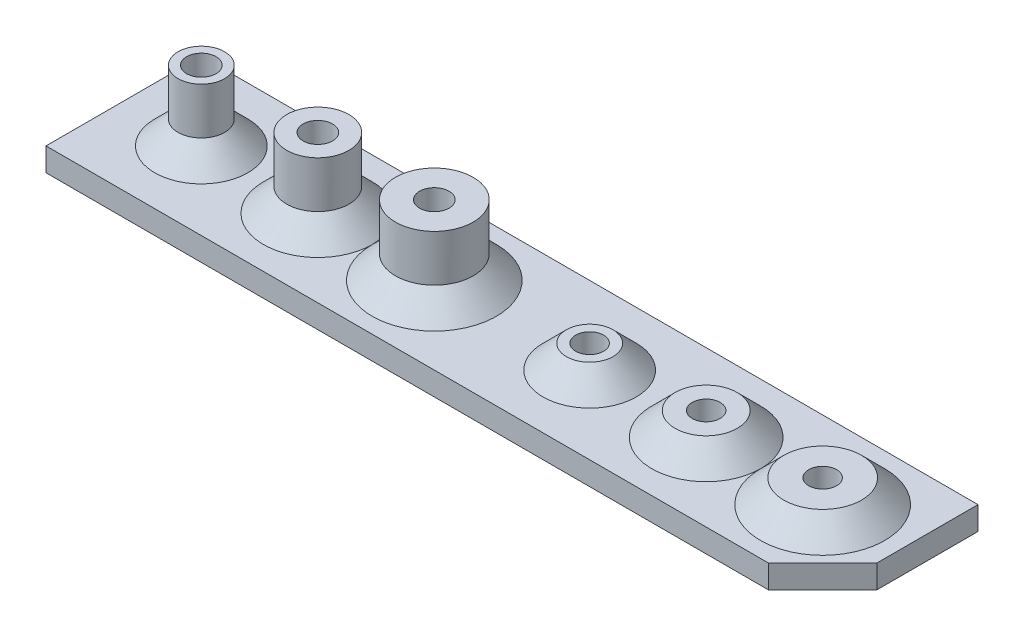
ISO-10303-21;
HEADER;
FILE_DESCRIPTION(('STEP AP214'),'2;1');
FILE_NAME('part.step','',(''),(''),'','','');
FILE_SCHEMA(('AUTOMOTIVE_DESIGN { 1 0 10303 214 1 1 1 1 }'));
ENDSEC;
DATA;
#1=APPLICATION_CONTEXT('core data for automotive mechanical design processes');
#2=APPLICATION_PROTOCOL_DEFINITION('international standard','automotive_design',2000,#1);
#3=PRODUCT_CONTEXT('',#1,'mechanical');
#4=PRODUCT('Part','Part','',(#3));
#5=PRODUCT_RELATED_PRODUCT_CATEGORY('part','',(#4));
#6=PRODUCT_DEFINITION_FORMATION('','',#4);
#7=PRODUCT_DEFINITION_CONTEXT('part definition',#1,'design');
#8=PRODUCT_DEFINITION('design','',#6,#7);
#9=PRODUCT_DEFINITION_SHAPE('','',#8);
#10=(LENGTH_UNIT() NAMED_UNIT(*) SI_UNIT(.MILLI.,.METRE.));
#11=(NAMED_UNIT(*) PLANE_ANGLE_UNIT() SI_UNIT($,.RADIAN.));
#12=(NAMED_UNIT(*) SI_UNIT($,.STERADIAN.) SOLID_ANGLE_UNIT());
#13=UNCERTAINTY_MEASURE_WITH_UNIT(LENGTH_MEASURE(1.E-05),#10,'distance_accuracy_value','');
#14=(GEOMETRIC_REPRESENTATION_CONTEXT(3) GLOBAL_UNCERTAINTY_ASSIGNED_CONTEXT((#13)) GLOBAL_UNIT_ASSIGNED_CONTEXT((#10,
#11,#12)) REPRESENTATION_CONTEXT('',''));
#15=CARTESIAN_POINT('',(0.,0.,0.));
#16=DIRECTION('',(0.,0.,1.));
#17=DIRECTION('',(1.,0.,0.));
#18=AXIS2_PLACEMENT_3D('',#15,#16,#17);
#19=CARTESIAN_POINT('',(50.,3.,10.));
#20=DIRECTION('',(-1.,0.,0.));
#21=DIRECTION('',(0.,0.,1.));
#22=AXIS2_PLACEMENT_3D('',#19,#20,#21);
#23=PLANE('',#22);
#24=DIRECTION('',(0.,0.,-1.));
#25=VECTOR('',#24,1.);
#26=CARTESIAN_POINT('',(50.,3.,10.));
#27=LINE('',#26,#25);
#28=CARTESIAN_POINT('',(50.,3.,3.00000000000001));
#29=VERTEX_POINT('',#28);
#30=CARTESIAN_POINT('',(50.,3.,-10.));
#31=VERTEX_POINT('',#30);
#32=EDGE_CURVE('E93',#29,#31,#27,.T.);
#33=ORIENTED_EDGE('',*,*,#32,.F.);
#34=DIRECTION('',(0.,-1.,0.));
#35=VECTOR('',#34,1.);
#36=CARTESIAN_POINT('',(50.,3.,3.00000000000001));
#37=LINE('',#36,#35);
#38=CARTESIAN_POINT('',(50.,0.,3.00000000000001));
#39=VERTEX_POINT('',#38);
#40=EDGE_CURVE('E152',#29,#39,#37,.T.);
#41=ORIENTED_EDGE('',*,*,#40,.T.);
#42=DIRECTION('',(0.,0.,-1.));
#43=VECTOR('',#42,1.);
#44=CARTESIAN_POINT('',(50.,0.,10.));
#45=LINE('',#44,#43);
#46=CARTESIAN_POINT('',(50.,0.,-10.));
#47=VERTEX_POINT('',#46);
#48=EDGE_CURVE('E114',#39,#47,#45,.T.);
#49=ORIENTED_EDGE('',*,*,#48,.T.);
#50=DIRECTION('',(0.,-1.,0.));
#51=VECTOR('',#50,1.);
#52=CARTESIAN_POINT('',(50.,3.,-10.));
#53=LINE('',#52,#51);
#54=EDGE_CURVE('E108',#31,#47,#53,.T.);
#55=ORIENTED_EDGE('',*,*,#54,.F.);
#56=EDGE_LOOP('',(#33,#41,#49,#55));
#57=FACE_BOUND('',#56,.T.);
#58=ADVANCED_FACE('F35',(#57),#23,.F.);
#59=CARTESIAN_POINT('',(-50.,3.,-10.));
#60=DIRECTION('',(0.,0.,1.));
#61=DIRECTION('',(1.,0.,0.));
#62=AXIS2_PLACEMENT_3D('',#59,#60,#61);
#63=PLANE('',#62);
#64=DIRECTION('',(-1.,0.,0.));
#65=VECTOR('',#64,1.);
#66=CARTESIAN_POINT('',(-50.,0.,-10.));
#67=LINE('',#66,#65);
#68=CARTESIAN_POINT('',(-50.,0.,-10.));
#69=VERTEX_POINT('',#68);
#70=EDGE_CURVE('E172',#47,#69,#67,.T.);
#71=ORIENTED_EDGE('',*,*,#70,.T.);
#72=DIRECTION('',(0.,-1.,0.));
#73=VECTOR('',#72,1.);
#74=CARTESIAN_POINT('',(-50.,3.,-10.));
#75=LINE('',#74,#73);
#76=CARTESIAN_POINT('',(-50.,3.,-10.));
#77=VERTEX_POINT('',#76);
#78=EDGE_CURVE('E110',#77,#69,#75,.T.);
#79=ORIENTED_EDGE('',*,*,#78,.F.);
#80=DIRECTION('',(-1.,0.,0.));
#81=VECTOR('',#80,1.);
#82=CARTESIAN_POINT('',(-50.,3.,-10.));
#83=LINE('',#82,#81);
#84=EDGE_CURVE('E96',#31,#77,#83,.T.);
#85=ORIENTED_EDGE('',*,*,#84,.F.);
#86=ORIENTED_EDGE('',*,*,#54,.T.);
#87=EDGE_LOOP('',(#71,#79,#85,#86));
#88=FACE_BOUND('',#87,.T.);
#89=ADVANCED_FACE('F107',(#88),#63,.F.);
#90=CARTESIAN_POINT('',(-50.,3.,10.));
#91=DIRECTION('',(1.,0.,0.));
#92=DIRECTION('',(0.,0.,-1.));
#93=AXIS2_PLACEMENT_3D('',#90,#91,#92);
#94=PLANE('',#93);
#95=DIRECTION('',(0.,0.,1.));
#96=VECTOR('',#95,1.);
#97=CARTESIAN_POINT('',(-50.,0.,10.));
#98=LINE('',#97,#96);
#99=CARTESIAN_POINT('',(-50.,0.,10.));
#100=VERTEX_POINT('',#99);
#101=EDGE_CURVE('E175',#69,#100,#98,.T.);
#102=ORIENTED_EDGE('',*,*,#101,.T.);
#103=DIRECTION('',(0.,-1.,0.));
#104=VECTOR('',#103,1.);
#105=CARTESIAN_POINT('',(-50.,3.,10.));
#106=LINE('',#105,#104);
#107=CARTESIAN_POINT('',(-50.,3.,10.));
#108=VERTEX_POINT('',#107);
#109=EDGE_CURVE('E121',#108,#100,#106,.T.);
#110=ORIENTED_EDGE('',*,*,#109,.F.);
#111=DIRECTION('',(0.,0.,1.));
#112=VECTOR('',#111,1.);
#113=CARTESIAN_POINT('',(-50.,3.,10.));
#114=LINE('',#113,#112);
#115=EDGE_CURVE('E112',#77,#108,#114,.T.);
#116=ORIENTED_EDGE('',*,*,#115,.F.);
#117=ORIENTED_EDGE('',*,*,#78,.T.);
#118=EDGE_LOOP('',(#102,#110,#116,#117));
#119=FACE_BOUND('',#118,.T.);
#120=ADVANCED_FACE('F298',(#119),#94,.F.);
#121=CARTESIAN_POINT('',(-50.,3.,10.));
#122=DIRECTION('',(0.,0.,-1.));
#123=DIRECTION('',(-1.,0.,0.));
#124=AXIS2_PLACEMENT_3D('',#121,#122,#123);
#125=PLANE('',#124);
#126=DIRECTION('',(1.,0.,0.));
#127=VECTOR('',#126,1.);
#128=CARTESIAN_POINT('',(-50.,0.,10.));
#129=LINE('',#128,#127);
#130=CARTESIAN_POINT('',(43.,0.,10.));
#131=VERTEX_POINT('',#130);
#132=EDGE_CURVE('E103',#100,#131,#129,.T.);
#133=ORIENTED_EDGE('',*,*,#132,.T.);
#134=DIRECTION('',(0.,1.,0.));
#135=VECTOR('',#134,1.);
#136=CARTESIAN_POINT('',(43.,3.,10.));
#137=LINE('',#136,#135);
#138=CARTESIAN_POINT('',(43.,3.,10.));
#139=VERTEX_POINT('',#138);
#140=EDGE_CURVE('E43',#131,#139,#137,.T.);
#141=ORIENTED_EDGE('',*,*,#140,.T.);
#142=DIRECTION('',(1.,0.,0.));
#143=VECTOR('',#142,1.);
#144=CARTESIAN_POINT('',(-50.,3.,10.));
#145=LINE('',#144,#143);
#146=EDGE_CURVE('E181',#108,#139,#145,.T.);
#147=ORIENTED_EDGE('',*,*,#146,.F.);
#148=ORIENTED_EDGE('',*,*,#109,.T.);
#149=EDGE_LOOP('',(#133,#141,#147,#148));
#150=FACE_BOUND('',#149,.T.);
#151=ADVANCED_FACE('F545',(#150),#125,.F.);
#152=CARTESIAN_POINT('',(0.,3.,0.));
#153=DIRECTION('',(0.,-1.,0.));
#154=DIRECTION('',(0.,0.,-1.));
#155=AXIS2_PLACEMENT_3D('',#152,#153,#154);
#156=PLANE('',#155);
#157=CARTESIAN_POINT('',(40.,3.,0.));
#158=DIRECTION('',(0.,-1.,0.));
#159=DIRECTION('',(0.,0.,-1.));
#160=AXIS2_PLACEMENT_3D('',#157,#158,#159);
#161=CIRCLE('',#160,7.99999999999999);
#162=CARTESIAN_POINT('',(32.,3.,0.));
#163=VERTEX_POINT('',#162);
#164=CARTESIAN_POINT('',(40.,3.,-7.99999999999999));
#165=VERTEX_POINT('',#164);
#166=EDGE_CURVE('E147',#163,#165,#161,.T.);
#167=ORIENTED_EDGE('',*,*,#166,.T.);
#168=CARTESIAN_POINT('',(40.,3.,0.));
#169=DIRECTION('',(0.,-1.,0.));
#170=DIRECTION('',(0.,0.,-1.));
#171=AXIS2_PLACEMENT_3D('',#168,#169,#170);
#172=CIRCLE('',#171,7.99999999999999);
#173=EDGE_CURVE('E149',#165,#163,#172,.T.);
#174=ORIENTED_EDGE('',*,*,#173,.T.);
#175=CARTESIAN_POINT('',(25.,3.,0.));
#176=DIRECTION('',(0.,-1.,0.));
#177=DIRECTION('',(0.,0.,-1.));
#178=AXIS2_PLACEMENT_3D('',#175,#176,#177);
#179=CIRCLE('',#178,6.99999999999999);
#180=CARTESIAN_POINT('',(25.,3.,-6.99999999999999));
#181=VERTEX_POINT('',#180);
#182=EDGE_CURVE('E142',#163,#181,#179,.T.);
#183=ORIENTED_EDGE('',*,*,#182,.T.);
#184=CARTESIAN_POINT('',(25.,3.,0.));
#185=DIRECTION('',(0.,-1.,0.));
#186=DIRECTION('',(0.,0.,-1.));
#187=AXIS2_PLACEMENT_3D('',#184,#185,#186);
#188=CIRCLE('',#187,6.99999999999999);
#189=EDGE_CURVE('E144',#181,#163,#188,.T.);
#190=ORIENTED_EDGE('',*,*,#189,.T.);
#191=EDGE_LOOP('',(#167,#174,#183,#190));
#192=FACE_BOUND('',#191,.T.);
#193=CARTESIAN_POINT('',(9.99999999999999,3.,0.));
#194=DIRECTION('',(0.,-1.,0.));
#195=DIRECTION('',(0.,0.,-1.));
#196=AXIS2_PLACEMENT_3D('',#193,#194,#195);
#197=CIRCLE('',#196,5.99999999999999);
#198=CARTESIAN_POINT('',(9.99999999999999,3.,-5.99999999999999));
#199=VERTEX_POINT('',#198);
#200=EDGE_CURVE('E139',#199,#199,#197,.T.);
#201=ORIENTED_EDGE('',*,*,#200,.T.);
#202=EDGE_LOOP('',(#201));
#203=FACE_BOUND('',#202,.T.);
#204=CARTESIAN_POINT('',(-25.,3.,0.));
#205=DIRECTION('',(0.,-1.,0.));
#206=DIRECTION('',(0.,0.,-1.));
#207=AXIS2_PLACEMENT_3D('',#204,#205,#206);
#208=CIRCLE('',#207,6.99999999999998);
#209=CARTESIAN_POINT('',(-18.,3.,0.));
#210=VERTEX_POINT('',#209);
#211=EDGE_CURVE('E130',#210,#210,#208,.T.);
#212=ORIENTED_EDGE('',*,*,#211,.T.);
#213=CARTESIAN_POINT('',(-10.,3.,0.));
#214=DIRECTION('',(0.,-1.,0.));
#215=DIRECTION('',(0.,0.,-1.));
#216=AXIS2_PLACEMENT_3D('',#213,#214,#215);
#217=CIRCLE('',#216,7.99999999999998);
#218=EDGE_CURVE('E136',#210,#210,#217,.T.);
#219=ORIENTED_EDGE('',*,*,#218,.T.);
#220=EDGE_LOOP('',(#212,#219));
#221=FACE_BOUND('',#220,.T.);
#222=CARTESIAN_POINT('',(-40.,3.,0.));
#223=DIRECTION('',(0.,-1.,0.));
#224=DIRECTION('',(0.,0.,-1.));
#225=AXIS2_PLACEMENT_3D('',#222,#223,#224);
#226=CIRCLE('',#225,5.99999999999998);
#227=CARTESIAN_POINT('',(-40.,3.,-5.99999999999998));
#228=VERTEX_POINT('',#227);
#229=EDGE_CURVE('E119',#228,#228,#226,.T.);
#230=ORIENTED_EDGE('',*,*,#229,.T.);
#231=EDGE_LOOP('',(#230));
#232=FACE_BOUND('',#231,.T.);
#233=ORIENTED_EDGE('',*,*,#146,.T.);
#234=DIRECTION('',(-0.707106781186549,0.,0.707106781186546));
#235=VECTOR('',#234,1.);
#236=CARTESIAN_POINT('',(50.,3.,3.00000000000001));
#237=LINE('',#236,#235);
#238=EDGE_CURVE('E11',#139,#29,#237,.F.);
#239=ORIENTED_EDGE('',*,*,#238,.T.);
#240=ORIENTED_EDGE('',*,*,#32,.T.);
#241=ORIENTED_EDGE('',*,*,#84,.T.);
#242=ORIENTED_EDGE('',*,*,#115,.T.);
#243=EDGE_LOOP('',(#233,#239,#240,#241,#242));
#244=FACE_BOUND('',#243,.T.);
#245=ADVANCED_FACE('F95',(#192,#203,#221,#232,#244),#156,.F.);
#246=CARTESIAN_POINT('',(0.,0.,0.));
#247=DIRECTION('',(0.,-1.,0.));
#248=DIRECTION('',(0.,0.,-1.));
#249=AXIS2_PLACEMENT_3D('',#246,#247,#248);
#250=PLANE('',#249);
#251=CARTESIAN_POINT('',(40.,0.,0.));
#252=DIRECTION('',(0.,-1.,0.));
#253=DIRECTION('',(0.,0.,-1.));
#254=AXIS2_PLACEMENT_3D('',#251,#252,#253);
#255=CIRCLE('',#254,3.375);
#256=CARTESIAN_POINT('',(40.,0.,-3.375));
#257=VERTEX_POINT('',#256);
#258=EDGE_CURVE('E256',#257,#257,#255,.T.);
#259=ORIENTED_EDGE('',*,*,#258,.F.);
#260=EDGE_LOOP('',(#259));
#261=FACE_BOUND('',#260,.T.);
#262=CARTESIAN_POINT('',(25.,0.,0.));
#263=DIRECTION('',(0.,-1.,0.));
#264=DIRECTION('',(0.,0.,-1.));
#265=AXIS2_PLACEMENT_3D('',#262,#263,#264);
#266=CIRCLE('',#265,3.375);
#267=CARTESIAN_POINT('',(25.,0.,-3.375));
#268=VERTEX_POINT('',#267);
#269=EDGE_CURVE('E166',#268,#268,#266,.T.);
#270=ORIENTED_EDGE('',*,*,#269,.F.);
#271=EDGE_LOOP('',(#270));
#272=FACE_BOUND('',#271,.T.);
#273=CARTESIAN_POINT('',(9.99999999999999,0.,0.));
#274=DIRECTION('',(0.,-1.,0.));
#275=DIRECTION('',(0.,0.,-1.));
#276=AXIS2_PLACEMENT_3D('',#273,#274,#275);
#277=CIRCLE('',#276,3.375);
#278=CARTESIAN_POINT('',(9.99999999999999,0.,-3.375));
#279=VERTEX_POINT('',#278);
#280=EDGE_CURVE('E161',#279,#279,#277,.T.);
#281=ORIENTED_EDGE('',*,*,#280,.F.);
#282=EDGE_LOOP('',(#281));
#283=FACE_BOUND('',#282,.T.);
#284=CARTESIAN_POINT('',(-10.,0.,0.));
#285=DIRECTION('',(0.,-1.,0.));
#286=DIRECTION('',(0.,0.,-1.));
#287=AXIS2_PLACEMENT_3D('',#284,#285,#286);
#288=CIRCLE('',#287,3.5433);
#289=CARTESIAN_POINT('',(-10.,0.,-3.5433));
#290=VERTEX_POINT('',#289);
#291=EDGE_CURVE('E217',#290,#290,#288,.T.);
#292=ORIENTED_EDGE('',*,*,#291,.F.);
#293=EDGE_LOOP('',(#292));
#294=FACE_BOUND('',#293,.T.);
#295=CARTESIAN_POINT('',(-25.,0.,0.));
#296=DIRECTION('',(0.,-1.,0.));
#297=DIRECTION('',(0.,0.,-1.));
#298=AXIS2_PLACEMENT_3D('',#295,#296,#297);
#299=CIRCLE('',#298,3.5433);
#300=CARTESIAN_POINT('',(-25.,0.,-3.5433));
#301=VERTEX_POINT('',#300);
#302=EDGE_CURVE('E208',#301,#301,#299,.T.);
#303=ORIENTED_EDGE('',*,*,#302,.F.);
#304=EDGE_LOOP('',(#303));
#305=FACE_BOUND('',#304,.T.);
#306=CARTESIAN_POINT('',(-40.,0.,0.));
#307=DIRECTION('',(0.,-1.,0.));
#308=DIRECTION('',(0.,0.,-1.));
#309=AXIS2_PLACEMENT_3D('',#306,#307,#308);
#310=CIRCLE('',#309,3.5433);
#311=CARTESIAN_POINT('',(-40.,0.,-3.5433));
#312=VERTEX_POINT('',#311);
#313=EDGE_CURVE('E199',#312,#312,#310,.T.);
#314=ORIENTED_EDGE('',*,*,#313,.F.);
#315=EDGE_LOOP('',(#314));
#316=FACE_BOUND('',#315,.T.);
#317=ORIENTED_EDGE('',*,*,#48,.F.);
#318=DIRECTION('',(0.707106781186549,0.,-0.707106781186546));
#319=VECTOR('',#318,1.);
#320=CARTESIAN_POINT('',(26.4999999999999,0.,26.5));
#321=LINE('',#320,#319);
#322=EDGE_CURVE('E57',#39,#131,#321,.F.);
#323=ORIENTED_EDGE('',*,*,#322,.T.);
#324=ORIENTED_EDGE('',*,*,#132,.F.);
#325=ORIENTED_EDGE('',*,*,#101,.F.);
#326=ORIENTED_EDGE('',*,*,#70,.F.);
#327=EDGE_LOOP('',(#317,#323,#324,#325,#326));
#328=FACE_BOUND('',#327,.T.);
#329=ADVANCED_FACE('F170',(#261,#272,#283,#294,#305,#316,#328),#250,.T.);
#330=CARTESIAN_POINT('',(-40.,12.,0.));
#331=DIRECTION('',(0.,-1.,0.));
#332=DIRECTION('',(0.,0.,-1.));
#333=AXIS2_PLACEMENT_3D('',#330,#331,#332);
#334=CYLINDRICAL_SURFACE('',#333,3.);
#335=CARTESIAN_POINT('',(-40.,6.00000000000002,0.));
#336=DIRECTION('',(0.,-1.,0.));
#337=DIRECTION('',(0.,0.,-1.));
#338=AXIS2_PLACEMENT_3D('',#335,#336,#337);
#339=CIRCLE('',#338,3.);
#340=CARTESIAN_POINT('',(-40.,6.00000000000002,-3.));
#341=VERTEX_POINT('',#340);
#342=EDGE_CURVE('E116',#341,#341,#339,.F.);
#343=ORIENTED_EDGE('',*,*,#342,.T.);
#344=EDGE_LOOP('',(#343));
#345=FACE_BOUND('',#344,.T.);
#346=CARTESIAN_POINT('',(-40.,12.,0.));
#347=DIRECTION('',(0.,1.,0.));
#348=DIRECTION('',(0.,0.,1.));
#349=AXIS2_PLACEMENT_3D('',#346,#347,#348);
#350=CIRCLE('',#349,3.);
#351=CARTESIAN_POINT('',(-40.,12.,3.));
#352=VERTEX_POINT('',#351);
#353=EDGE_CURVE('E173',#352,#352,#350,.T.);
#354=ORIENTED_EDGE('',*,*,#353,.F.);
#355=EDGE_LOOP('',(#354));
#356=FACE_BOUND('',#355,.T.);
#357=ADVANCED_FACE('F264',(#345,#356),#334,.T.);
#358=CARTESIAN_POINT('',(-40.,12.,0.));
#359=DIRECTION('',(0.,1.,0.));
#360=DIRECTION('',(0.,0.,1.));
#361=AXIS2_PLACEMENT_3D('',#358,#359,#360);
#362=PLANE('',#361);
#363=CARTESIAN_POINT('',(-40.,12.,0.));
#364=DIRECTION('',(0.,-1.,0.));
#365=DIRECTION('',(0.,0.,-1.));
#366=AXIS2_PLACEMENT_3D('',#363,#364,#365);
#367=CIRCLE('',#366,1.89864999999999);
#368=CARTESIAN_POINT('',(-40.,12.,-1.89864999999999));
#369=VERTEX_POINT('',#368);
#370=EDGE_CURVE('E193',#369,#369,#367,.T.);
#371=ORIENTED_EDGE('',*,*,#370,.T.);
#372=EDGE_LOOP('',(#371));
#373=FACE_BOUND('',#372,.T.);
#374=ORIENTED_EDGE('',*,*,#353,.T.);
#375=EDGE_LOOP('',(#374));
#376=FACE_BOUND('',#375,.T.);
#377=ADVANCED_FACE('F580',(#373,#376),#362,.T.);
#378=CARTESIAN_POINT('',(-25.,12.,0.));
#379=DIRECTION('',(0.,-1.,0.));
#380=DIRECTION('',(0.,0.,-1.));
#381=AXIS2_PLACEMENT_3D('',#378,#379,#380);
#382=CYLINDRICAL_SURFACE('',#381,4.);
#383=CARTESIAN_POINT('',(-25.,6.00000000000002,0.));
#384=DIRECTION('',(0.,-1.,0.));
#385=DIRECTION('',(0.,0.,-1.));
#386=AXIS2_PLACEMENT_3D('',#383,#384,#385);
#387=CIRCLE('',#386,4.);
#388=CARTESIAN_POINT('',(-25.,6.00000000000002,-4.));
#389=VERTEX_POINT('',#388);
#390=EDGE_CURVE('E127',#389,#389,#387,.F.);
#391=ORIENTED_EDGE('',*,*,#390,.T.);
#392=EDGE_LOOP('',(#391));
#393=FACE_BOUND('',#392,.T.);
#394=CARTESIAN_POINT('',(-25.,12.,0.));
#395=DIRECTION('',(0.,1.,0.));
#396=DIRECTION('',(0.,0.,1.));
#397=AXIS2_PLACEMENT_3D('',#394,#395,#396);
#398=CIRCLE('',#397,4.);
#399=CARTESIAN_POINT('',(-25.,12.,4.));
#400=VERTEX_POINT('',#399);
#401=EDGE_CURVE('E178',#400,#400,#398,.T.);
#402=ORIENTED_EDGE('',*,*,#401,.F.);
#403=EDGE_LOOP('',(#402));
#404=FACE_BOUND('',#403,.T.);
#405=ADVANCED_FACE('F589',(#393,#404),#382,.T.);
#406=CARTESIAN_POINT('',(-25.,12.,0.));
#407=DIRECTION('',(0.,1.,0.));
#408=DIRECTION('',(0.,0.,1.));
#409=AXIS2_PLACEMENT_3D('',#406,#407,#408);
#410=PLANE('',#409);
#411=CARTESIAN_POINT('',(-25.,12.,0.));
#412=DIRECTION('',(0.,-1.,0.));
#413=DIRECTION('',(0.,0.,-1.));
#414=AXIS2_PLACEMENT_3D('',#411,#412,#413);
#415=CIRCLE('',#414,1.89865);
#416=CARTESIAN_POINT('',(-25.,12.,-1.89865));
#417=VERTEX_POINT('',#416);
#418=EDGE_CURVE('E202',#417,#417,#415,.T.);
#419=ORIENTED_EDGE('',*,*,#418,.T.);
#420=EDGE_LOOP('',(#419));
#421=FACE_BOUND('',#420,.T.);
#422=ORIENTED_EDGE('',*,*,#401,.T.);
#423=EDGE_LOOP('',(#422));
#424=FACE_BOUND('',#423,.T.);
#425=ADVANCED_FACE('F597',(#421,#424),#410,.T.);
#426=CARTESIAN_POINT('',(-10.,12.,0.));
#427=DIRECTION('',(0.,-1.,0.));
#428=DIRECTION('',(0.,0.,-1.));
#429=AXIS2_PLACEMENT_3D('',#426,#427,#428);
#430=CYLINDRICAL_SURFACE('',#429,5.);
#431=CARTESIAN_POINT('',(-10.,6.00000000000001,0.));
#432=DIRECTION('',(0.,-1.,0.));
#433=DIRECTION('',(0.,0.,-1.));
#434=AXIS2_PLACEMENT_3D('',#431,#432,#433);
#435=CIRCLE('',#434,5.);
#436=CARTESIAN_POINT('',(-10.,6.00000000000001,-5.));
#437=VERTEX_POINT('',#436);
#438=EDGE_CURVE('E133',#437,#437,#435,.F.);
#439=ORIENTED_EDGE('',*,*,#438,.T.);
#440=EDGE_LOOP('',(#439));
#441=FACE_BOUND('',#440,.T.);
#442=CARTESIAN_POINT('',(-10.,12.,0.));
#443=DIRECTION('',(0.,1.,0.));
#444=DIRECTION('',(0.,0.,1.));
#445=AXIS2_PLACEMENT_3D('',#442,#443,#444);
#446=CIRCLE('',#445,5.);
#447=CARTESIAN_POINT('',(-10.,12.,5.));
#448=VERTEX_POINT('',#447);
#449=EDGE_CURVE('E190',#448,#448,#446,.T.);
#450=ORIENTED_EDGE('',*,*,#449,.F.);
#451=EDGE_LOOP('',(#450));
#452=FACE_BOUND('',#451,.T.);
#453=ADVANCED_FACE('F605',(#441,#452),#430,.T.);
#454=CARTESIAN_POINT('',(-10.,12.,0.));
#455=DIRECTION('',(0.,1.,0.));
#456=DIRECTION('',(0.,0.,1.));
#457=AXIS2_PLACEMENT_3D('',#454,#455,#456);
#458=PLANE('',#457);
#459=CARTESIAN_POINT('',(-10.,12.,0.));
#460=DIRECTION('',(0.,-1.,0.));
#461=DIRECTION('',(0.,0.,-1.));
#462=AXIS2_PLACEMENT_3D('',#459,#460,#461);
#463=CIRCLE('',#462,1.89865);
#464=CARTESIAN_POINT('',(-10.,12.,-1.89865));
#465=VERTEX_POINT('',#464);
#466=EDGE_CURVE('E211',#465,#465,#463,.T.);
#467=ORIENTED_EDGE('',*,*,#466,.T.);
#468=EDGE_LOOP('',(#467));
#469=FACE_BOUND('',#468,.T.);
#470=ORIENTED_EDGE('',*,*,#449,.T.);
#471=EDGE_LOOP('',(#470));
#472=FACE_BOUND('',#471,.T.);
#473=ADVANCED_FACE('F304',(#469,#472),#458,.T.);
#474=CARTESIAN_POINT('',(-40.,6.00000000000002,0.));
#475=DIRECTION('',(0.,-1.,0.));
#476=DIRECTION('',(0.,0.,-1.));
#477=AXIS2_PLACEMENT_3D('',#474,#475,#476);
#478=CONICAL_SURFACE('',#477,3.,0.785398163397442);
#479=ORIENTED_EDGE('',*,*,#229,.F.);
#480=EDGE_LOOP('',(#479));
#481=FACE_BOUND('',#480,.T.);
#482=ORIENTED_EDGE('',*,*,#342,.F.);
#483=EDGE_LOOP('',(#482));
#484=FACE_BOUND('',#483,.T.);
#485=ADVANCED_FACE('F289',(#481,#484),#478,.T.);
#486=CARTESIAN_POINT('',(-40.,0.,0.));
#487=DIRECTION('',(0.,-1.,0.));
#488=DIRECTION('',(0.,0.,-1.));
#489=AXIS2_PLACEMENT_3D('',#486,#487,#488);
#490=CYLINDRICAL_SURFACE('',#489,1.89864999999999);
#491=ORIENTED_EDGE('',*,*,#370,.F.);
#492=EDGE_LOOP('',(#491));
#493=FACE_BOUND('',#492,.T.);
#494=CARTESIAN_POINT('',(-40.,1.38002520841572,0.));
#495=DIRECTION('',(0.,-1.,0.));
#496=DIRECTION('',(0.,0.,-1.));
#497=AXIS2_PLACEMENT_3D('',#494,#495,#496);
#498=CIRCLE('',#497,1.89864999999999);
#499=CARTESIAN_POINT('',(-40.,1.38002520841572,-1.89864999999999));
#500=VERTEX_POINT('',#499);
#501=EDGE_CURVE('E196',#500,#500,#498,.T.);
#502=ORIENTED_EDGE('',*,*,#501,.T.);
#503=EDGE_LOOP('',(#502));
#504=FACE_BOUND('',#503,.T.);
#505=ADVANCED_FACE('F279',(#493,#504),#490,.F.);
#506=CARTESIAN_POINT('',(-40.,0.,0.));
#507=DIRECTION('',(0.,-1.,0.));
#508=DIRECTION('',(0.,0.,-1.));
#509=AXIS2_PLACEMENT_3D('',#506,#507,#508);
#510=CONICAL_SURFACE('',#509,3.5433,0.872664625997165);
#511=ORIENTED_EDGE('',*,*,#501,.F.);
#512=EDGE_LOOP('',(#511));
#513=FACE_BOUND('',#512,.T.);
#514=ORIENTED_EDGE('',*,*,#313,.T.);
#515=EDGE_LOOP('',(#514));
#516=FACE_BOUND('',#515,.T.);
#517=ADVANCED_FACE('F276',(#513,#516),#510,.F.);
#518=CARTESIAN_POINT('',(-25.,0.,0.));
#519=DIRECTION('',(0.,-1.,0.));
#520=DIRECTION('',(0.,0.,-1.));
#521=AXIS2_PLACEMENT_3D('',#518,#519,#520);
#522=CYLINDRICAL_SURFACE('',#521,1.89864999999999);
#523=ORIENTED_EDGE('',*,*,#418,.F.);
#524=EDGE_LOOP('',(#523));
#525=FACE_BOUND('',#524,.T.);
#526=CARTESIAN_POINT('',(-25.,1.38002520841571,0.));
#527=DIRECTION('',(0.,-1.,0.));
#528=DIRECTION('',(0.,0.,-1.));
#529=AXIS2_PLACEMENT_3D('',#526,#527,#528);
#530=CIRCLE('',#529,1.89864999999999);
#531=CARTESIAN_POINT('',(-25.,1.38002520841571,-1.89864999999999));
#532=VERTEX_POINT('',#531);
#533=EDGE_CURVE('E205',#532,#532,#530,.T.);
#534=ORIENTED_EDGE('',*,*,#533,.T.);
#535=EDGE_LOOP('',(#534));
#536=FACE_BOUND('',#535,.T.);
#537=ADVANCED_FACE('F278',(#525,#536),#522,.F.);
#538=CARTESIAN_POINT('',(-25.,0.,0.));
#539=DIRECTION('',(0.,-1.,0.));
#540=DIRECTION('',(0.,0.,-1.));
#541=AXIS2_PLACEMENT_3D('',#538,#539,#540);
#542=CONICAL_SURFACE('',#541,3.5433,0.872664625997169);
#543=ORIENTED_EDGE('',*,*,#533,.F.);
#544=EDGE_LOOP('',(#543));
#545=FACE_BOUND('',#544,.T.);
#546=ORIENTED_EDGE('',*,*,#302,.T.);
#547=EDGE_LOOP('',(#546));
#548=FACE_BOUND('',#547,.T.);
#549=ADVANCED_FACE('F286',(#545,#548),#542,.F.);
#550=CARTESIAN_POINT('',(-10.,0.,0.));
#551=DIRECTION('',(0.,-1.,0.));
#552=DIRECTION('',(0.,0.,-1.));
#553=AXIS2_PLACEMENT_3D('',#550,#551,#552);
#554=CYLINDRICAL_SURFACE('',#553,1.89864999999999);
#555=ORIENTED_EDGE('',*,*,#466,.F.);
#556=EDGE_LOOP('',(#555));
#557=FACE_BOUND('',#556,.T.);
#558=CARTESIAN_POINT('',(-10.,1.38002520841571,0.));
#559=DIRECTION('',(0.,-1.,0.));
#560=DIRECTION('',(0.,0.,-1.));
#561=AXIS2_PLACEMENT_3D('',#558,#559,#560);
#562=CIRCLE('',#561,1.89864999999999);
#563=CARTESIAN_POINT('',(-10.,1.38002520841571,-1.89864999999999));
#564=VERTEX_POINT('',#563);
#565=EDGE_CURVE('E214',#564,#564,#562,.T.);
#566=ORIENTED_EDGE('',*,*,#565,.T.);
#567=EDGE_LOOP('',(#566));
#568=FACE_BOUND('',#567,.T.);
#569=ADVANCED_FACE('F352',(#557,#568),#554,.F.);
#570=CARTESIAN_POINT('',(-10.,0.,0.));
#571=DIRECTION('',(0.,-1.,0.));
#572=DIRECTION('',(0.,0.,-1.));
#573=AXIS2_PLACEMENT_3D('',#570,#571,#572);
#574=CONICAL_SURFACE('',#573,3.5433,0.872664625997169);
#575=ORIENTED_EDGE('',*,*,#565,.F.);
#576=EDGE_LOOP('',(#575));
#577=FACE_BOUND('',#576,.T.);
#578=ORIENTED_EDGE('',*,*,#291,.T.);
#579=EDGE_LOOP('',(#578));
#580=FACE_BOUND('',#579,.T.);
#581=ADVANCED_FACE('F310',(#577,#580),#574,.F.);
#582=CARTESIAN_POINT('',(-25.,6.00000000000002,0.));
#583=DIRECTION('',(0.,-1.,0.));
#584=DIRECTION('',(0.,0.,-1.));
#585=AXIS2_PLACEMENT_3D('',#582,#583,#584);
#586=CONICAL_SURFACE('',#585,4.,0.785398163397441);
#587=ORIENTED_EDGE('',*,*,#211,.F.);
#588=EDGE_LOOP('',(#587));
#589=FACE_BOUND('',#588,.T.);
#590=ORIENTED_EDGE('',*,*,#390,.F.);
#591=EDGE_LOOP('',(#590));
#592=FACE_BOUND('',#591,.T.);
#593=ADVANCED_FACE('F306',(#589,#592),#586,.T.);
#594=CARTESIAN_POINT('',(-10.,6.00000000000001,0.));
#595=DIRECTION('',(0.,-1.,0.));
#596=DIRECTION('',(0.,0.,-1.));
#597=AXIS2_PLACEMENT_3D('',#594,#595,#596);
#598=CONICAL_SURFACE('',#597,5.,0.785398163397443);
#599=ORIENTED_EDGE('',*,*,#218,.F.);
#600=EDGE_LOOP('',(#599));
#601=FACE_BOUND('',#600,.T.);
#602=ORIENTED_EDGE('',*,*,#438,.F.);
#603=EDGE_LOOP('',(#602));
#604=FACE_BOUND('',#603,.T.);
#605=ADVANCED_FACE('F309',(#601,#604),#598,.T.);
#606=CARTESIAN_POINT('',(9.99999999999999,6.,0.));
#607=DIRECTION('',(0.,1.,0.));
#608=DIRECTION('',(0.,0.,1.));
#609=AXIS2_PLACEMENT_3D('',#606,#607,#608);
#610=PLANE('',#609);
#611=CARTESIAN_POINT('',(9.99999999999999,6.,0.));
#612=DIRECTION('',(0.,1.,0.));
#613=DIRECTION('',(0.,0.,1.));
#614=AXIS2_PLACEMENT_3D('',#611,#612,#613);
#615=CIRCLE('',#614,1.8);
#616=CARTESIAN_POINT('',(9.99999999999999,6.,1.8));
#617=VERTEX_POINT('',#616);
#618=EDGE_CURVE('E153',#617,#617,#615,.T.);
#619=ORIENTED_EDGE('',*,*,#618,.F.);
#620=EDGE_LOOP('',(#619));
#621=FACE_BOUND('',#620,.T.);
#622=CARTESIAN_POINT('',(9.99999999999999,6.,0.));
#623=DIRECTION('',(0.,1.,0.));
#624=DIRECTION('',(0.,0.,1.));
#625=AXIS2_PLACEMENT_3D('',#622,#623,#624);
#626=CIRCLE('',#625,3.);
#627=CARTESIAN_POINT('',(9.99999999999999,6.,3.));
#628=VERTEX_POINT('',#627);
#629=EDGE_CURVE('E220',#628,#628,#626,.T.);
#630=ORIENTED_EDGE('',*,*,#629,.T.);
#631=EDGE_LOOP('',(#630));
#632=FACE_BOUND('',#631,.T.);
#633=ADVANCED_FACE('F314',(#621,#632),#610,.T.);
#634=CARTESIAN_POINT('',(25.,6.,0.));
#635=DIRECTION('',(0.,1.,0.));
#636=DIRECTION('',(0.,0.,1.));
#637=AXIS2_PLACEMENT_3D('',#634,#635,#636);
#638=PLANE('',#637);
#639=CARTESIAN_POINT('',(25.,6.,0.));
#640=DIRECTION('',(0.,1.,0.));
#641=DIRECTION('',(0.,0.,1.));
#642=AXIS2_PLACEMENT_3D('',#639,#640,#641);
#643=CIRCLE('',#642,1.8);
#644=CARTESIAN_POINT('',(25.,6.,1.8));
#645=VERTEX_POINT('',#644);
#646=EDGE_CURVE('E158',#645,#645,#643,.T.);
#647=ORIENTED_EDGE('',*,*,#646,.F.);
#648=EDGE_LOOP('',(#647));
#649=FACE_BOUND('',#648,.T.);
#650=CARTESIAN_POINT('',(25.,6.,0.));
#651=DIRECTION('',(0.,1.,0.));
#652=DIRECTION('',(0.,0.,1.));
#653=AXIS2_PLACEMENT_3D('',#650,#651,#652);
#654=CIRCLE('',#653,4.);
#655=CARTESIAN_POINT('',(25.,6.,4.));
#656=VERTEX_POINT('',#655);
#657=EDGE_CURVE('E223',#656,#656,#654,.T.);
#658=ORIENTED_EDGE('',*,*,#657,.T.);
#659=EDGE_LOOP('',(#658));
#660=FACE_BOUND('',#659,.T.);
#661=ADVANCED_FACE('F339',(#649,#660),#638,.T.);
#662=CARTESIAN_POINT('',(40.,6.,0.));
#663=DIRECTION('',(0.,1.,0.));
#664=DIRECTION('',(0.,0.,1.));
#665=AXIS2_PLACEMENT_3D('',#662,#663,#664);
#666=PLANE('',#665);
#667=CARTESIAN_POINT('',(40.,6.,0.));
#668=DIRECTION('',(0.,1.,0.));
#669=DIRECTION('',(0.,0.,1.));
#670=AXIS2_PLACEMENT_3D('',#667,#668,#669);
#671=CIRCLE('',#670,1.8);
#672=CARTESIAN_POINT('',(40.,6.,1.8));
#673=VERTEX_POINT('',#672);
#674=EDGE_CURVE('E163',#673,#673,#671,.T.);
#675=ORIENTED_EDGE('',*,*,#674,.F.);
#676=EDGE_LOOP('',(#675));
#677=FACE_BOUND('',#676,.T.);
#678=CARTESIAN_POINT('',(40.,6.,0.));
#679=DIRECTION('',(0.,1.,0.));
#680=DIRECTION('',(0.,0.,1.));
#681=AXIS2_PLACEMENT_3D('',#678,#679,#680);
#682=CIRCLE('',#681,5.);
#683=CARTESIAN_POINT('',(40.,6.,5.));
#684=VERTEX_POINT('',#683);
#685=EDGE_CURVE('E156',#684,#684,#682,.T.);
#686=ORIENTED_EDGE('',*,*,#685,.T.);
#687=EDGE_LOOP('',(#686));
#688=FACE_BOUND('',#687,.T.);
#689=ADVANCED_FACE('F320',(#677,#688),#666,.T.);
#690=CARTESIAN_POINT('',(40.,6.00000000000003,0.));
#691=DIRECTION('',(0.,-1.,0.));
#692=DIRECTION('',(0.,0.,-1.));
#693=AXIS2_PLACEMENT_3D('',#690,#691,#692);
#694=CONICAL_SURFACE('',#693,5.,0.785398163397443);
#695=ORIENTED_EDGE('',*,*,#166,.F.);
#696=ORIENTED_EDGE('',*,*,#173,.F.);
#697=EDGE_LOOP('',(#695,#696));
#698=FACE_BOUND('',#697,.T.);
#699=ORIENTED_EDGE('',*,*,#685,.F.);
#700=EDGE_LOOP('',(#699));
#701=FACE_BOUND('',#700,.T.);
#702=ADVANCED_FACE('F316',(#698,#701),#694,.T.);
#703=CARTESIAN_POINT('',(25.,6.00000000000002,0.));
#704=DIRECTION('',(0.,-1.,0.));
#705=DIRECTION('',(0.,0.,-1.));
#706=AXIS2_PLACEMENT_3D('',#703,#704,#705);
#707=CONICAL_SURFACE('',#706,4.,0.785398163397444);
#708=ORIENTED_EDGE('',*,*,#182,.F.);
#709=ORIENTED_EDGE('',*,*,#189,.F.);
#710=EDGE_LOOP('',(#708,#709));
#711=FACE_BOUND('',#710,.T.);
#712=ORIENTED_EDGE('',*,*,#657,.F.);
#713=EDGE_LOOP('',(#712));
#714=FACE_BOUND('',#713,.T.);
#715=ADVANCED_FACE('F319',(#711,#714),#707,.T.);
#716=CARTESIAN_POINT('',(9.99999999999999,6.00000000000003,0.));
#717=DIRECTION('',(0.,-1.,0.));
#718=DIRECTION('',(0.,0.,-1.));
#719=AXIS2_PLACEMENT_3D('',#716,#717,#718);
#720=CONICAL_SURFACE('',#719,3.,0.785398163397442);
#721=ORIENTED_EDGE('',*,*,#200,.F.);
#722=EDGE_LOOP('',(#721));
#723=FACE_BOUND('',#722,.T.);
#724=ORIENTED_EDGE('',*,*,#629,.F.);
#725=EDGE_LOOP('',(#724));
#726=FACE_BOUND('',#725,.T.);
#727=ADVANCED_FACE('F323',(#723,#726),#720,.T.);
#728=CARTESIAN_POINT('',(9.99999999999999,0.,0.));
#729=DIRECTION('',(0.,-1.,0.));
#730=DIRECTION('',(0.,0.,-1.));
#731=AXIS2_PLACEMENT_3D('',#728,#729,#730);
#732=CYLINDRICAL_SURFACE('',#731,1.8);
#733=ORIENTED_EDGE('',*,*,#618,.T.);
#734=EDGE_LOOP('',(#733));
#735=FACE_BOUND('',#734,.T.);
#736=CARTESIAN_POINT('',(9.99999999999999,1.65,0.));
#737=DIRECTION('',(0.,-1.,0.));
#738=DIRECTION('',(0.,0.,-1.));
#739=AXIS2_PLACEMENT_3D('',#736,#737,#738);
#740=CIRCLE('',#739,1.8);
#741=CARTESIAN_POINT('',(9.99999999999999,1.65,-1.8));
#742=VERTEX_POINT('',#741);
#743=EDGE_CURVE('E157',#742,#742,#740,.T.);
#744=ORIENTED_EDGE('',*,*,#743,.T.);
#745=EDGE_LOOP('',(#744));
#746=FACE_BOUND('',#745,.T.);
#747=ADVANCED_FACE('F326',(#735,#746),#732,.F.);
#748=CARTESIAN_POINT('',(13.35,1.65,0.));
#749=DIRECTION('',(0.,1.,0.));
#750=DIRECTION('',(0.,0.,1.));
#751=AXIS2_PLACEMENT_3D('',#748,#749,#750);
#752=PLANE('',#751);
#753=ORIENTED_EDGE('',*,*,#743,.F.);
#754=EDGE_LOOP('',(#753));
#755=FACE_BOUND('',#754,.T.);
#756=CARTESIAN_POINT('',(9.99999999999999,1.65,0.));
#757=DIRECTION('',(0.,-1.,0.));
#758=DIRECTION('',(0.,0.,-1.));
#759=AXIS2_PLACEMENT_3D('',#756,#757,#758);
#760=CIRCLE('',#759,3.35);
#761=CARTESIAN_POINT('',(9.99999999999999,1.65,-3.35));
#762=VERTEX_POINT('',#761);
#763=EDGE_CURVE('E230',#762,#762,#760,.T.);
#764=ORIENTED_EDGE('',*,*,#763,.T.);
#765=EDGE_LOOP('',(#764));
#766=FACE_BOUND('',#765,.T.);
#767=ADVANCED_FACE('F331',(#755,#766),#752,.F.);
#768=CARTESIAN_POINT('',(9.99999999999999,0.,0.));
#769=DIRECTION('',(0.,-1.,0.));
#770=DIRECTION('',(0.,0.,-1.));
#771=AXIS2_PLACEMENT_3D('',#768,#769,#770);
#772=CYLINDRICAL_SURFACE('',#771,3.35);
#773=ORIENTED_EDGE('',*,*,#763,.F.);
#774=EDGE_LOOP('',(#773));
#775=FACE_BOUND('',#774,.T.);
#776=CARTESIAN_POINT('',(9.99999999999999,0.0249999999999988,0.));
#777=DIRECTION('',(0.,-1.,0.));
#778=DIRECTION('',(0.,0.,-1.));
#779=AXIS2_PLACEMENT_3D('',#776,#777,#778);
#780=CIRCLE('',#779,3.35);
#781=CARTESIAN_POINT('',(9.99999999999999,0.0249999999999988,-3.35));
#782=VERTEX_POINT('',#781);
#783=EDGE_CURVE('E233',#782,#782,#780,.T.);
#784=ORIENTED_EDGE('',*,*,#783,.T.);
#785=EDGE_LOOP('',(#784));
#786=FACE_BOUND('',#785,.T.);
#787=ADVANCED_FACE('F423',(#775,#786),#772,.F.);
#788=CARTESIAN_POINT('',(9.99999999999999,0.,0.));
#789=DIRECTION('',(0.,-1.,0.));
#790=DIRECTION('',(0.,0.,-1.));
#791=AXIS2_PLACEMENT_3D('',#788,#789,#790);
#792=CONICAL_SURFACE('',#791,3.375,0.785398163397418);
#793=ORIENTED_EDGE('',*,*,#783,.F.);
#794=EDGE_LOOP('',(#793));
#795=FACE_BOUND('',#794,.T.);
#796=ORIENTED_EDGE('',*,*,#280,.T.);
#797=EDGE_LOOP('',(#796));
#798=FACE_BOUND('',#797,.T.);
#799=ADVANCED_FACE('F433',(#795,#798),#792,.F.);
#800=CARTESIAN_POINT('',(25.,0.,0.));
#801=DIRECTION('',(0.,-1.,0.));
#802=DIRECTION('',(0.,0.,-1.));
#803=AXIS2_PLACEMENT_3D('',#800,#801,#802);
#804=CYLINDRICAL_SURFACE('',#803,1.8);
#805=ORIENTED_EDGE('',*,*,#646,.T.);
#806=EDGE_LOOP('',(#805));
#807=FACE_BOUND('',#806,.T.);
#808=CARTESIAN_POINT('',(25.,1.65,0.));
#809=DIRECTION('',(0.,-1.,0.));
#810=DIRECTION('',(0.,0.,-1.));
#811=AXIS2_PLACEMENT_3D('',#808,#809,#810);
#812=CIRCLE('',#811,1.8);
#813=CARTESIAN_POINT('',(25.,1.65,-1.8));
#814=VERTEX_POINT('',#813);
#815=EDGE_CURVE('E162',#814,#814,#812,.T.);
#816=ORIENTED_EDGE('',*,*,#815,.T.);
#817=EDGE_LOOP('',(#816));
#818=FACE_BOUND('',#817,.T.);
#819=ADVANCED_FACE('F443',(#807,#818),#804,.F.);
#820=CARTESIAN_POINT('',(28.35,1.65,0.));
#821=DIRECTION('',(0.,1.,0.));
#822=DIRECTION('',(0.,0.,1.));
#823=AXIS2_PLACEMENT_3D('',#820,#821,#822);
#824=PLANE('',#823);
#825=ORIENTED_EDGE('',*,*,#815,.F.);
#826=EDGE_LOOP('',(#825));
#827=FACE_BOUND('',#826,.T.);
#828=CARTESIAN_POINT('',(25.,1.65,0.));
#829=DIRECTION('',(0.,-1.,0.));
#830=DIRECTION('',(0.,0.,-1.));
#831=AXIS2_PLACEMENT_3D('',#828,#829,#830);
#832=CIRCLE('',#831,3.35);
#833=CARTESIAN_POINT('',(25.,1.65,-3.35));
#834=VERTEX_POINT('',#833);
#835=EDGE_CURVE('E240',#834,#834,#832,.T.);
#836=ORIENTED_EDGE('',*,*,#835,.T.);
#837=EDGE_LOOP('',(#836));
#838=FACE_BOUND('',#837,.T.);
#839=ADVANCED_FACE('F464',(#827,#838),#824,.F.);
#840=CARTESIAN_POINT('',(25.,0.,0.));
#841=DIRECTION('',(0.,-1.,0.));
#842=DIRECTION('',(0.,0.,-1.));
#843=AXIS2_PLACEMENT_3D('',#840,#841,#842);
#844=CYLINDRICAL_SURFACE('',#843,3.35);
#845=ORIENTED_EDGE('',*,*,#835,.F.);
#846=EDGE_LOOP('',(#845));
#847=FACE_BOUND('',#846,.T.);
#848=CARTESIAN_POINT('',(25.,0.0249999999999988,0.));
#849=DIRECTION('',(0.,-1.,0.));
#850=DIRECTION('',(0.,0.,-1.));
#851=AXIS2_PLACEMENT_3D('',#848,#849,#850);
#852=CIRCLE('',#851,3.35);
#853=CARTESIAN_POINT('',(25.,0.0249999999999988,-3.35));
#854=VERTEX_POINT('',#853);
#855=EDGE_CURVE('E243',#854,#854,#852,.T.);
#856=ORIENTED_EDGE('',*,*,#855,.T.);
#857=EDGE_LOOP('',(#856));
#858=FACE_BOUND('',#857,.T.);
#859=ADVANCED_FACE('F474',(#847,#858),#844,.F.);
#860=CARTESIAN_POINT('',(25.,0.,0.));
#861=DIRECTION('',(0.,-1.,0.));
#862=DIRECTION('',(0.,0.,-1.));
#863=AXIS2_PLACEMENT_3D('',#860,#861,#862);
#864=CONICAL_SURFACE('',#863,3.375,0.785398163397418);
#865=ORIENTED_EDGE('',*,*,#855,.F.);
#866=EDGE_LOOP('',(#865));
#867=FACE_BOUND('',#866,.T.);
#868=ORIENTED_EDGE('',*,*,#269,.T.);
#869=EDGE_LOOP('',(#868));
#870=FACE_BOUND('',#869,.T.);
#871=ADVANCED_FACE('F484',(#867,#870),#864,.F.);
#872=CARTESIAN_POINT('',(40.,0.,0.));
#873=DIRECTION('',(0.,-1.,0.));
#874=DIRECTION('',(0.,0.,-1.));
#875=AXIS2_PLACEMENT_3D('',#872,#873,#874);
#876=CYLINDRICAL_SURFACE('',#875,1.8);
#877=ORIENTED_EDGE('',*,*,#674,.T.);
#878=EDGE_LOOP('',(#877));
#879=FACE_BOUND('',#878,.T.);
#880=CARTESIAN_POINT('',(40.,1.65,0.));
#881=DIRECTION('',(0.,-1.,0.));
#882=DIRECTION('',(0.,0.,-1.));
#883=AXIS2_PLACEMENT_3D('',#880,#881,#882);
#884=CIRCLE('',#883,1.8);
#885=CARTESIAN_POINT('',(40.,1.65,-1.8));
#886=VERTEX_POINT('',#885);
#887=EDGE_CURVE('E167',#886,#886,#884,.T.);
#888=ORIENTED_EDGE('',*,*,#887,.T.);
#889=EDGE_LOOP('',(#888));
#890=FACE_BOUND('',#889,.T.);
#891=ADVANCED_FACE('F494',(#879,#890),#876,.F.);
#892=CARTESIAN_POINT('',(43.35,1.65,0.));
#893=DIRECTION('',(0.,1.,0.));
#894=DIRECTION('',(0.,0.,1.));
#895=AXIS2_PLACEMENT_3D('',#892,#893,#894);
#896=PLANE('',#895);
#897=ORIENTED_EDGE('',*,*,#887,.F.);
#898=EDGE_LOOP('',(#897));
#899=FACE_BOUND('',#898,.T.);
#900=CARTESIAN_POINT('',(40.,1.65,0.));
#901=DIRECTION('',(0.,-1.,0.));
#902=DIRECTION('',(0.,0.,-1.));
#903=AXIS2_PLACEMENT_3D('',#900,#901,#902);
#904=CIRCLE('',#903,3.35);
#905=CARTESIAN_POINT('',(40.,1.65,-3.35));
#906=VERTEX_POINT('',#905);
#907=EDGE_CURVE('E250',#906,#906,#904,.T.);
#908=ORIENTED_EDGE('',*,*,#907,.T.);
#909=EDGE_LOOP('',(#908));
#910=FACE_BOUND('',#909,.T.);
#911=ADVANCED_FACE('F504',(#899,#910),#896,.F.);
#912=CARTESIAN_POINT('',(40.,0.,0.));
#913=DIRECTION('',(0.,-1.,0.));
#914=DIRECTION('',(0.,0.,-1.));
#915=AXIS2_PLACEMENT_3D('',#912,#913,#914);
#916=CYLINDRICAL_SURFACE('',#915,3.35);
#917=ORIENTED_EDGE('',*,*,#907,.F.);
#918=EDGE_LOOP('',(#917));
#919=FACE_BOUND('',#918,.T.);
#920=CARTESIAN_POINT('',(40.,0.0249999999999988,0.));
#921=DIRECTION('',(0.,-1.,0.));
#922=DIRECTION('',(0.,0.,-1.));
#923=AXIS2_PLACEMENT_3D('',#920,#921,#922);
#924=CIRCLE('',#923,3.35);
#925=CARTESIAN_POINT('',(40.,0.0249999999999988,-3.35));
#926=VERTEX_POINT('',#925);
#927=EDGE_CURVE('E253',#926,#926,#924,.T.);
#928=ORIENTED_EDGE('',*,*,#927,.T.);
#929=EDGE_LOOP('',(#928));
#930=FACE_BOUND('',#929,.T.);
#931=ADVANCED_FACE('F514',(#919,#930),#916,.F.);
#932=CARTESIAN_POINT('',(40.,0.,0.));
#933=DIRECTION('',(0.,-1.,0.));
#934=DIRECTION('',(0.,0.,-1.));
#935=AXIS2_PLACEMENT_3D('',#932,#933,#934);
#936=CONICAL_SURFACE('',#935,3.375,0.785398163397557);
#937=ORIENTED_EDGE('',*,*,#927,.F.);
#938=EDGE_LOOP('',(#937));
#939=FACE_BOUND('',#938,.T.);
#940=ORIENTED_EDGE('',*,*,#258,.T.);
#941=EDGE_LOOP('',(#940));
#942=FACE_BOUND('',#941,.T.);
#943=ADVANCED_FACE('F260',(#939,#942),#936,.F.);
#944=CARTESIAN_POINT('',(50.,3.,3.00000000000001));
#945=DIRECTION('',(-0.707106781186546,0.,-0.707106781186549));
#946=DIRECTION('',(0.,-1.,0.));
#947=AXIS2_PLACEMENT_3D('',#944,#945,#946);
#948=PLANE('',#947);
#949=ORIENTED_EDGE('',*,*,#238,.F.);
#950=ORIENTED_EDGE('',*,*,#140,.F.);
#951=ORIENTED_EDGE('',*,*,#322,.F.);
#952=ORIENTED_EDGE('',*,*,#40,.F.);
#953=EDGE_LOOP('',(#949,#950,#951,#952));
#954=FACE_BOUND('',#953,.T.);
#955=ADVANCED_FACE('F37',(#954),#948,.F.);
#956=CLOSED_SHELL('',(#58,#89,#120,#151,#245,#329,#357,#377,#405,#425,#453,#473,#485,#505,#517,
#537,#549,#569,#581,#593,#605,#633,#661,#689,#702,#715,#727,#747,#767,#787,#799,#819,#839,#859,
#871,#891,#911,#931,#943,#955));
#957=MANIFOLD_SOLID_BREP('B2',#956);
#958=ADVANCED_BREP_SHAPE_REPRESENTATION('',(#18,#957),#14);
#959=SHAPE_DEFINITION_REPRESENTATION(#9,#958);
ENDSEC;
END-ISO-10303-21;
